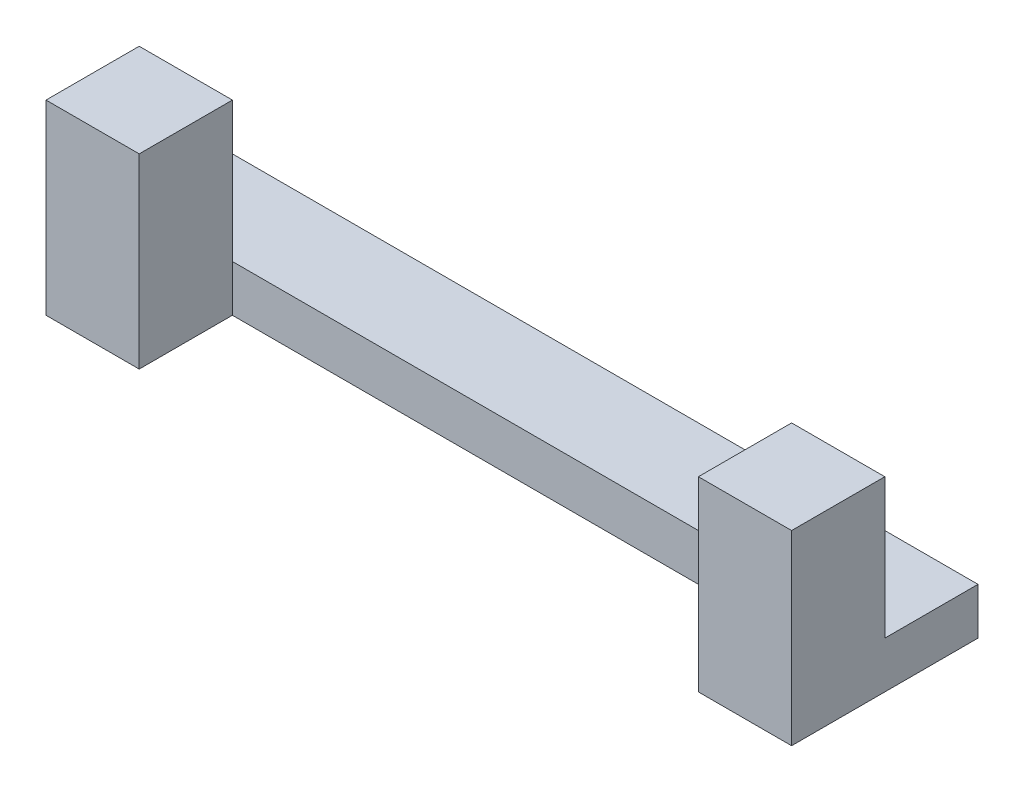
ISO-10303-21;
HEADER;
FILE_DESCRIPTION(('STEP AP214'),'2;1');
FILE_NAME('part.step','',(''),(''),'','','');
FILE_SCHEMA(('AUTOMOTIVE_DESIGN { 1 0 10303 214 1 1 1 1 }'));
ENDSEC;
DATA;
#1=APPLICATION_CONTEXT('core data for automotive mechanical design processes');
#2=APPLICATION_PROTOCOL_DEFINITION('international standard','automotive_design',2000,#1);
#3=PRODUCT_CONTEXT('',#1,'mechanical');
#4=PRODUCT('Part','Part','',(#3));
#5=PRODUCT_RELATED_PRODUCT_CATEGORY('part','',(#4));
#6=PRODUCT_DEFINITION_FORMATION('','',#4);
#7=PRODUCT_DEFINITION_CONTEXT('part definition',#1,'design');
#8=PRODUCT_DEFINITION('design','',#6,#7);
#9=PRODUCT_DEFINITION_SHAPE('','',#8);
#10=(LENGTH_UNIT() NAMED_UNIT(*) SI_UNIT(.MILLI.,.METRE.));
#11=(NAMED_UNIT(*) PLANE_ANGLE_UNIT() SI_UNIT($,.RADIAN.));
#12=(NAMED_UNIT(*) SI_UNIT($,.STERADIAN.) SOLID_ANGLE_UNIT());
#13=UNCERTAINTY_MEASURE_WITH_UNIT(LENGTH_MEASURE(1.E-05),#10,'distance_accuracy_value','');
#14=(GEOMETRIC_REPRESENTATION_CONTEXT(3) GLOBAL_UNCERTAINTY_ASSIGNED_CONTEXT((#13)) GLOBAL_UNIT_ASSIGNED_CONTEXT((#10,
#11,#12)) REPRESENTATION_CONTEXT('',''));
#15=CARTESIAN_POINT('',(0.,0.,0.));
#16=DIRECTION('',(0.,0.,1.));
#17=DIRECTION('',(1.,0.,0.));
#18=AXIS2_PLACEMENT_3D('',#15,#16,#17);
#19=CARTESIAN_POINT('',(-100.,12.5,12.5));
#20=DIRECTION('',(0.,0.,-1.));
#21=DIRECTION('',(-1.,0.,0.));
#22=AXIS2_PLACEMENT_3D('',#19,#20,#21);
#23=PLANE('',#22);
#24=DIRECTION('',(0.,-1.,0.));
#25=VECTOR('',#24,1.);
#26=CARTESIAN_POINT('',(75.,50.,12.5));
#27=LINE('',#26,#25);
#28=CARTESIAN_POINT('',(75.,12.5,12.5));
#29=VERTEX_POINT('',#28);
#30=CARTESIAN_POINT('',(75.,0.,12.5));
#31=VERTEX_POINT('',#30);
#32=EDGE_CURVE('E58',#29,#31,#27,.T.);
#33=ORIENTED_EDGE('',*,*,#32,.F.);
#34=DIRECTION('',(1.,0.,0.));
#35=VECTOR('',#34,1.);
#36=CARTESIAN_POINT('',(-100.,12.5,12.5));
#37=LINE('',#36,#35);
#38=CARTESIAN_POINT('',(-75.,12.5,12.5));
#39=VERTEX_POINT('',#38);
#40=EDGE_CURVE('E207',#39,#29,#37,.T.);
#41=ORIENTED_EDGE('',*,*,#40,.F.);
#42=DIRECTION('',(0.,-1.,0.));
#43=VECTOR('',#42,1.);
#44=CARTESIAN_POINT('',(-75.,50.,12.5));
#45=LINE('',#44,#43);
#46=CARTESIAN_POINT('',(-75.,0.,12.5));
#47=VERTEX_POINT('',#46);
#48=EDGE_CURVE('E11',#39,#47,#45,.T.);
#49=ORIENTED_EDGE('',*,*,#48,.T.);
#50=DIRECTION('',(1.,0.,0.));
#51=VECTOR('',#50,1.);
#52=CARTESIAN_POINT('',(-100.,0.,12.5));
#53=LINE('',#52,#51);
#54=EDGE_CURVE('E62',#47,#31,#53,.T.);
#55=ORIENTED_EDGE('',*,*,#54,.T.);
#56=EDGE_LOOP('',(#33,#41,#49,#55));
#57=FACE_BOUND('',#56,.T.);
#58=ADVANCED_FACE('F39',(#57),#23,.F.);
#59=CARTESIAN_POINT('',(-100.,12.5,12.5));
#60=DIRECTION('',(-1.,0.,0.));
#61=DIRECTION('',(0.,0.,1.));
#62=AXIS2_PLACEMENT_3D('',#59,#60,#61);
#63=PLANE('',#62);
#64=DIRECTION('',(0.,0.,-1.));
#65=VECTOR('',#64,1.);
#66=CARTESIAN_POINT('',(-100.,0.,12.5));
#67=LINE('',#66,#65);
#68=CARTESIAN_POINT('',(-100.,0.,37.5));
#69=VERTEX_POINT('',#68);
#70=CARTESIAN_POINT('',(-100.,0.,-12.5));
#71=VERTEX_POINT('',#70);
#72=EDGE_CURVE('E196',#69,#71,#67,.T.);
#73=ORIENTED_EDGE('',*,*,#72,.F.);
#74=DIRECTION('',(0.,-1.,0.));
#75=VECTOR('',#74,1.);
#76=CARTESIAN_POINT('',(-100.,50.,37.5));
#77=LINE('',#76,#75);
#78=CARTESIAN_POINT('',(-100.,50.,37.5));
#79=VERTEX_POINT('',#78);
#80=EDGE_CURVE('E192',#79,#69,#77,.T.);
#81=ORIENTED_EDGE('',*,*,#80,.F.);
#82=DIRECTION('',(0.,0.,1.));
#83=VECTOR('',#82,1.);
#84=CARTESIAN_POINT('',(-100.,50.,12.5));
#85=LINE('',#84,#83);
#86=CARTESIAN_POINT('',(-100.,50.,12.5));
#87=VERTEX_POINT('',#86);
#88=EDGE_CURVE('E164',#87,#79,#85,.T.);
#89=ORIENTED_EDGE('',*,*,#88,.F.);
#90=DIRECTION('',(0.,-1.,0.));
#91=VECTOR('',#90,1.);
#92=CARTESIAN_POINT('',(-100.,50.,12.5));
#93=LINE('',#92,#91);
#94=CARTESIAN_POINT('',(-100.,12.5,12.5));
#95=VERTEX_POINT('',#94);
#96=EDGE_CURVE('E178',#87,#95,#93,.T.);
#97=ORIENTED_EDGE('',*,*,#96,.T.);
#98=DIRECTION('',(0.,0.,-1.));
#99=VECTOR('',#98,1.);
#100=CARTESIAN_POINT('',(-100.,12.5,12.5));
#101=LINE('',#100,#99);
#102=CARTESIAN_POINT('',(-100.,12.5,-12.5));
#103=VERTEX_POINT('',#102);
#104=EDGE_CURVE('E197',#95,#103,#101,.T.);
#105=ORIENTED_EDGE('',*,*,#104,.T.);
#106=DIRECTION('',(0.,-1.,0.));
#107=VECTOR('',#106,1.);
#108=CARTESIAN_POINT('',(-100.,12.5,-12.5));
#109=LINE('',#108,#107);
#110=EDGE_CURVE('E43',#103,#71,#109,.T.);
#111=ORIENTED_EDGE('',*,*,#110,.T.);
#112=EDGE_LOOP('',(#73,#81,#89,#97,#105,#111));
#113=FACE_BOUND('',#112,.T.);
#114=ADVANCED_FACE('F41',(#113),#63,.T.);
#115=CARTESIAN_POINT('',(100.,12.5,12.5));
#116=DIRECTION('',(-1.,0.,0.));
#117=DIRECTION('',(0.,0.,1.));
#118=AXIS2_PLACEMENT_3D('',#115,#116,#117);
#119=PLANE('',#118);
#120=DIRECTION('',(0.,0.,-1.));
#121=VECTOR('',#120,1.);
#122=CARTESIAN_POINT('',(100.,0.,12.5));
#123=LINE('',#122,#121);
#124=CARTESIAN_POINT('',(100.,0.,37.5));
#125=VERTEX_POINT('',#124);
#126=CARTESIAN_POINT('',(100.,0.,-12.5));
#127=VERTEX_POINT('',#126);
#128=EDGE_CURVE('E219',#125,#127,#123,.T.);
#129=ORIENTED_EDGE('',*,*,#128,.T.);
#130=DIRECTION('',(0.,-1.,0.));
#131=VECTOR('',#130,1.);
#132=CARTESIAN_POINT('',(100.,12.5,-12.5));
#133=LINE('',#132,#131);
#134=CARTESIAN_POINT('',(100.,12.5,-12.5));
#135=VERTEX_POINT('',#134);
#136=EDGE_CURVE('E49',#135,#127,#133,.T.);
#137=ORIENTED_EDGE('',*,*,#136,.F.);
#138=DIRECTION('',(0.,0.,-1.));
#139=VECTOR('',#138,1.);
#140=CARTESIAN_POINT('',(100.,12.5,12.5));
#141=LINE('',#140,#139);
#142=CARTESIAN_POINT('',(100.,12.5,12.5));
#143=VERTEX_POINT('',#142);
#144=EDGE_CURVE('E153',#143,#135,#141,.T.);
#145=ORIENTED_EDGE('',*,*,#144,.F.);
#146=DIRECTION('',(0.,-1.,0.));
#147=VECTOR('',#146,1.);
#148=CARTESIAN_POINT('',(100.,50.,12.5));
#149=LINE('',#148,#147);
#150=CARTESIAN_POINT('',(100.,50.,12.5));
#151=VERTEX_POINT('',#150);
#152=EDGE_CURVE('E130',#151,#143,#149,.T.);
#153=ORIENTED_EDGE('',*,*,#152,.F.);
#154=DIRECTION('',(0.,0.,-1.));
#155=VECTOR('',#154,1.);
#156=CARTESIAN_POINT('',(100.,50.,12.5));
#157=LINE('',#156,#155);
#158=CARTESIAN_POINT('',(100.,50.,37.5));
#159=VERTEX_POINT('',#158);
#160=EDGE_CURVE('E137',#159,#151,#157,.T.);
#161=ORIENTED_EDGE('',*,*,#160,.F.);
#162=DIRECTION('',(0.,-1.,0.));
#163=VECTOR('',#162,1.);
#164=CARTESIAN_POINT('',(100.,50.,37.5));
#165=LINE('',#164,#163);
#166=EDGE_CURVE('E250',#159,#125,#165,.T.);
#167=ORIENTED_EDGE('',*,*,#166,.T.);
#168=EDGE_LOOP('',(#129,#137,#145,#153,#161,#167));
#169=FACE_BOUND('',#168,.T.);
#170=ADVANCED_FACE('F151',(#169),#119,.F.);
#171=CARTESIAN_POINT('',(-100.,12.5,-12.5));
#172=DIRECTION('',(0.,0.,-1.));
#173=DIRECTION('',(-1.,0.,0.));
#174=AXIS2_PLACEMENT_3D('',#171,#172,#173);
#175=PLANE('',#174);
#176=DIRECTION('',(1.,0.,0.));
#177=VECTOR('',#176,1.);
#178=CARTESIAN_POINT('',(-100.,0.,-12.5));
#179=LINE('',#178,#177);
#180=EDGE_CURVE('E215',#71,#127,#179,.T.);
#181=ORIENTED_EDGE('',*,*,#180,.F.);
#182=ORIENTED_EDGE('',*,*,#110,.F.);
#183=DIRECTION('',(1.,0.,0.));
#184=VECTOR('',#183,1.);
#185=CARTESIAN_POINT('',(-100.,12.5,-12.5));
#186=LINE('',#185,#184);
#187=EDGE_CURVE('E201',#103,#135,#186,.T.);
#188=ORIENTED_EDGE('',*,*,#187,.T.);
#189=ORIENTED_EDGE('',*,*,#136,.T.);
#190=EDGE_LOOP('',(#181,#182,#188,#189));
#191=FACE_BOUND('',#190,.T.);
#192=ADVANCED_FACE('F232',(#191),#175,.T.);
#193=CARTESIAN_POINT('',(0.,12.5,0.));
#194=DIRECTION('',(0.,-1.,0.));
#195=DIRECTION('',(0.,0.,-1.));
#196=AXIS2_PLACEMENT_3D('',#193,#194,#195);
#197=PLANE('',#196);
#198=ORIENTED_EDGE('',*,*,#104,.F.);
#199=EDGE_CURVE('E208',#95,#39,#37,.T.);
#200=ORIENTED_EDGE('',*,*,#199,.T.);
#201=ORIENTED_EDGE('',*,*,#40,.T.);
#202=DIRECTION('',(-1.,0.,0.));
#203=VECTOR('',#202,1.);
#204=CARTESIAN_POINT('',(0.,12.5,12.5));
#205=LINE('',#204,#203);
#206=EDGE_CURVE('E155',#143,#29,#205,.T.);
#207=ORIENTED_EDGE('',*,*,#206,.F.);
#208=ORIENTED_EDGE('',*,*,#144,.T.);
#209=ORIENTED_EDGE('',*,*,#187,.F.);
#210=EDGE_LOOP('',(#198,#200,#201,#207,#208,#209));
#211=FACE_BOUND('',#210,.T.);
#212=ADVANCED_FACE('F249',(#211),#197,.F.);
#213=CARTESIAN_POINT('',(0.,0.,0.));
#214=DIRECTION('',(0.,-1.,0.));
#215=DIRECTION('',(0.,0.,-1.));
#216=AXIS2_PLACEMENT_3D('',#213,#214,#215);
#217=PLANE('',#216);
#218=ORIENTED_EDGE('',*,*,#72,.T.);
#219=ORIENTED_EDGE('',*,*,#180,.T.);
#220=ORIENTED_EDGE('',*,*,#128,.F.);
#221=DIRECTION('',(1.,0.,0.));
#222=VECTOR('',#221,1.);
#223=CARTESIAN_POINT('',(100.,0.,37.5));
#224=LINE('',#223,#222);
#225=CARTESIAN_POINT('',(75.,0.,37.5));
#226=VERTEX_POINT('',#225);
#227=EDGE_CURVE('E147',#226,#125,#224,.T.);
#228=ORIENTED_EDGE('',*,*,#227,.F.);
#229=DIRECTION('',(0.,0.,1.));
#230=VECTOR('',#229,1.);
#231=CARTESIAN_POINT('',(75.,0.,12.5));
#232=LINE('',#231,#230);
#233=EDGE_CURVE('E260',#31,#226,#232,.T.);
#234=ORIENTED_EDGE('',*,*,#233,.F.);
#235=ORIENTED_EDGE('',*,*,#54,.F.);
#236=DIRECTION('',(0.,0.,-1.));
#237=VECTOR('',#236,1.);
#238=CARTESIAN_POINT('',(-75.,0.,12.5));
#239=LINE('',#238,#237);
#240=CARTESIAN_POINT('',(-75.,0.,37.5));
#241=VERTEX_POINT('',#240);
#242=EDGE_CURVE('E169',#241,#47,#239,.T.);
#243=ORIENTED_EDGE('',*,*,#242,.F.);
#244=DIRECTION('',(1.,0.,0.));
#245=VECTOR('',#244,1.);
#246=CARTESIAN_POINT('',(-100.,0.,37.5));
#247=LINE('',#246,#245);
#248=EDGE_CURVE('E159',#69,#241,#247,.T.);
#249=ORIENTED_EDGE('',*,*,#248,.F.);
#250=EDGE_LOOP('',(#218,#219,#220,#228,#234,#235,#243,#249));
#251=FACE_BOUND('',#250,.T.);
#252=ADVANCED_FACE('F234',(#251),#217,.T.);
#253=CARTESIAN_POINT('',(-100.,50.,37.5));
#254=DIRECTION('',(0.,0.,-1.));
#255=DIRECTION('',(-1.,0.,0.));
#256=AXIS2_PLACEMENT_3D('',#253,#254,#255);
#257=PLANE('',#256);
#258=ORIENTED_EDGE('',*,*,#248,.T.);
#259=DIRECTION('',(0.,-1.,0.));
#260=VECTOR('',#259,1.);
#261=CARTESIAN_POINT('',(-75.,50.,37.5));
#262=LINE('',#261,#260);
#263=CARTESIAN_POINT('',(-75.,50.,37.5));
#264=VERTEX_POINT('',#263);
#265=EDGE_CURVE('E188',#264,#241,#262,.T.);
#266=ORIENTED_EDGE('',*,*,#265,.F.);
#267=DIRECTION('',(1.,0.,0.));
#268=VECTOR('',#267,1.);
#269=CARTESIAN_POINT('',(-100.,50.,37.5));
#270=LINE('',#269,#268);
#271=EDGE_CURVE('E168',#79,#264,#270,.T.);
#272=ORIENTED_EDGE('',*,*,#271,.F.);
#273=ORIENTED_EDGE('',*,*,#80,.T.);
#274=EDGE_LOOP('',(#258,#266,#272,#273));
#275=FACE_BOUND('',#274,.T.);
#276=ADVANCED_FACE('F238',(#275),#257,.F.);
#277=CARTESIAN_POINT('',(-75.,50.,12.5));
#278=DIRECTION('',(-1.,0.,0.));
#279=DIRECTION('',(0.,0.,1.));
#280=AXIS2_PLACEMENT_3D('',#277,#278,#279);
#281=PLANE('',#280);
#282=ORIENTED_EDGE('',*,*,#242,.T.);
#283=ORIENTED_EDGE('',*,*,#48,.F.);
#284=CARTESIAN_POINT('',(-75.,50.,12.5));
#285=VERTEX_POINT('',#284);
#286=EDGE_CURVE('E51',#285,#39,#45,.T.);
#287=ORIENTED_EDGE('',*,*,#286,.F.);
#288=DIRECTION('',(0.,0.,-1.));
#289=VECTOR('',#288,1.);
#290=CARTESIAN_POINT('',(-75.,50.,12.5));
#291=LINE('',#290,#289);
#292=EDGE_CURVE('E172',#264,#285,#291,.T.);
#293=ORIENTED_EDGE('',*,*,#292,.F.);
#294=ORIENTED_EDGE('',*,*,#265,.T.);
#295=EDGE_LOOP('',(#282,#283,#287,#293,#294));
#296=FACE_BOUND('',#295,.T.);
#297=ADVANCED_FACE('F301',(#296),#281,.F.);
#298=CARTESIAN_POINT('',(-100.,50.,12.5));
#299=DIRECTION('',(0.,0.,1.));
#300=DIRECTION('',(1.,0.,0.));
#301=AXIS2_PLACEMENT_3D('',#298,#299,#300);
#302=PLANE('',#301);
#303=ORIENTED_EDGE('',*,*,#199,.F.);
#304=ORIENTED_EDGE('',*,*,#96,.F.);
#305=DIRECTION('',(-1.,0.,0.));
#306=VECTOR('',#305,1.);
#307=CARTESIAN_POINT('',(-100.,50.,12.5));
#308=LINE('',#307,#306);
#309=EDGE_CURVE('E175',#285,#87,#308,.T.);
#310=ORIENTED_EDGE('',*,*,#309,.F.);
#311=ORIENTED_EDGE('',*,*,#286,.T.);
#312=EDGE_LOOP('',(#303,#304,#310,#311));
#313=FACE_BOUND('',#312,.T.);
#314=ADVANCED_FACE('F247',(#313),#302,.F.);
#315=CARTESIAN_POINT('',(0.,50.,0.));
#316=DIRECTION('',(0.,1.,0.));
#317=DIRECTION('',(0.,0.,1.));
#318=AXIS2_PLACEMENT_3D('',#315,#316,#317);
#319=PLANE('',#318);
#320=ORIENTED_EDGE('',*,*,#88,.T.);
#321=ORIENTED_EDGE('',*,*,#271,.T.);
#322=ORIENTED_EDGE('',*,*,#292,.T.);
#323=ORIENTED_EDGE('',*,*,#309,.T.);
#324=EDGE_LOOP('',(#320,#321,#322,#323));
#325=FACE_BOUND('',#324,.T.);
#326=ADVANCED_FACE('F242',(#325),#319,.T.);
#327=CARTESIAN_POINT('',(100.,50.,12.5));
#328=DIRECTION('',(0.,0.,1.));
#329=DIRECTION('',(1.,0.,0.));
#330=AXIS2_PLACEMENT_3D('',#327,#328,#329);
#331=PLANE('',#330);
#332=ORIENTED_EDGE('',*,*,#152,.T.);
#333=ORIENTED_EDGE('',*,*,#206,.T.);
#334=CARTESIAN_POINT('',(75.,50.,12.5));
#335=VERTEX_POINT('',#334);
#336=EDGE_CURVE('E132',#335,#29,#27,.T.);
#337=ORIENTED_EDGE('',*,*,#336,.F.);
#338=DIRECTION('',(-1.,0.,0.));
#339=VECTOR('',#338,1.);
#340=CARTESIAN_POINT('',(100.,50.,12.5));
#341=LINE('',#340,#339);
#342=EDGE_CURVE('E125',#151,#335,#341,.T.);
#343=ORIENTED_EDGE('',*,*,#342,.F.);
#344=EDGE_LOOP('',(#332,#333,#337,#343));
#345=FACE_BOUND('',#344,.T.);
#346=ADVANCED_FACE('F127',(#345),#331,.F.);
#347=CARTESIAN_POINT('',(75.,50.,12.5));
#348=DIRECTION('',(1.,0.,0.));
#349=DIRECTION('',(0.,0.,-1.));
#350=AXIS2_PLACEMENT_3D('',#347,#348,#349);
#351=PLANE('',#350);
#352=ORIENTED_EDGE('',*,*,#233,.T.);
#353=DIRECTION('',(0.,-1.,0.));
#354=VECTOR('',#353,1.);
#355=CARTESIAN_POINT('',(75.,50.,37.5));
#356=LINE('',#355,#354);
#357=CARTESIAN_POINT('',(75.,50.,37.5));
#358=VERTEX_POINT('',#357);
#359=EDGE_CURVE('E258',#358,#226,#356,.T.);
#360=ORIENTED_EDGE('',*,*,#359,.F.);
#361=DIRECTION('',(0.,0.,1.));
#362=VECTOR('',#361,1.);
#363=CARTESIAN_POINT('',(75.,50.,12.5));
#364=LINE('',#363,#362);
#365=EDGE_CURVE('E136',#335,#358,#364,.T.);
#366=ORIENTED_EDGE('',*,*,#365,.F.);
#367=ORIENTED_EDGE('',*,*,#336,.T.);
#368=ORIENTED_EDGE('',*,*,#32,.T.);
#369=EDGE_LOOP('',(#352,#360,#366,#367,#368));
#370=FACE_BOUND('',#369,.T.);
#371=ADVANCED_FACE('F270',(#370),#351,.F.);
#372=CARTESIAN_POINT('',(100.,50.,37.5));
#373=DIRECTION('',(0.,0.,-1.));
#374=DIRECTION('',(-1.,0.,0.));
#375=AXIS2_PLACEMENT_3D('',#372,#373,#374);
#376=PLANE('',#375);
#377=ORIENTED_EDGE('',*,*,#227,.T.);
#378=ORIENTED_EDGE('',*,*,#166,.F.);
#379=DIRECTION('',(1.,0.,0.));
#380=VECTOR('',#379,1.);
#381=CARTESIAN_POINT('',(100.,50.,37.5));
#382=LINE('',#381,#380);
#383=EDGE_CURVE('E142',#358,#159,#382,.T.);
#384=ORIENTED_EDGE('',*,*,#383,.F.);
#385=ORIENTED_EDGE('',*,*,#359,.T.);
#386=EDGE_LOOP('',(#377,#378,#384,#385));
#387=FACE_BOUND('',#386,.T.);
#388=ADVANCED_FACE('F256',(#387),#376,.F.);
#389=CARTESIAN_POINT('',(0.,50.,0.));
#390=DIRECTION('',(0.,-1.,0.));
#391=DIRECTION('',(0.,0.,-1.));
#392=AXIS2_PLACEMENT_3D('',#389,#390,#391);
#393=PLANE('',#392);
#394=ORIENTED_EDGE('',*,*,#160,.T.);
#395=ORIENTED_EDGE('',*,*,#342,.T.);
#396=ORIENTED_EDGE('',*,*,#365,.T.);
#397=ORIENTED_EDGE('',*,*,#383,.T.);
#398=EDGE_LOOP('',(#394,#395,#396,#397));
#399=FACE_BOUND('',#398,.T.);
#400=ADVANCED_FACE('F140',(#399),#393,.F.);
#401=CLOSED_SHELL('',(#58,#114,#170,#192,#212,#252,#276,#297,#314,#326,#346,#371,#388,#400));
#402=MANIFOLD_SOLID_BREP('B2',#401);
#403=ADVANCED_BREP_SHAPE_REPRESENTATION('',(#18,#402),#14);
#404=SHAPE_DEFINITION_REPRESENTATION(#9,#403);
ENDSEC;
END-ISO-10303-21;
